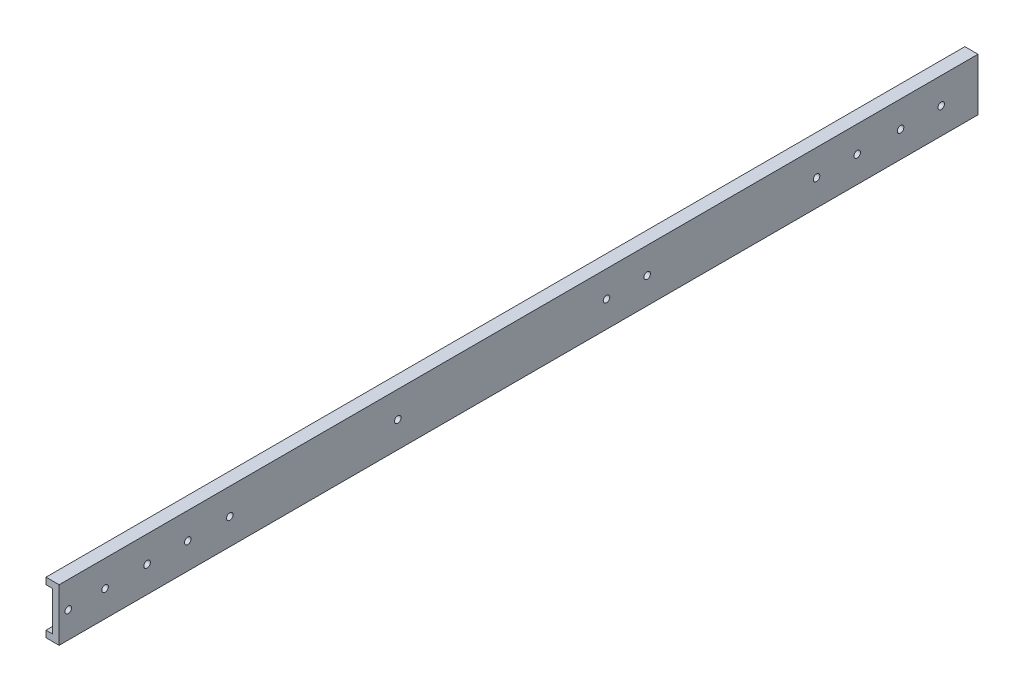
ISO-10303-21;
HEADER;
FILE_DESCRIPTION(('STEP AP214'),'2;1');
FILE_NAME('part.step','',(''),(''),'','','');
FILE_SCHEMA(('AUTOMOTIVE_DESIGN { 1 0 10303 214 1 1 1 1 }'));
ENDSEC;
DATA;
#1=APPLICATION_CONTEXT('core data for automotive mechanical design processes');
#2=APPLICATION_PROTOCOL_DEFINITION('international standard','automotive_design',2000,#1);
#3=PRODUCT_CONTEXT('',#1,'mechanical');
#4=PRODUCT('Part','Part','',(#3));
#5=PRODUCT_RELATED_PRODUCT_CATEGORY('part','',(#4));
#6=PRODUCT_DEFINITION_FORMATION('','',#4);
#7=PRODUCT_DEFINITION_CONTEXT('part definition',#1,'design');
#8=PRODUCT_DEFINITION('design','',#6,#7);
#9=PRODUCT_DEFINITION_SHAPE('','',#8);
#10=(LENGTH_UNIT() NAMED_UNIT(*) SI_UNIT(.MILLI.,.METRE.));
#11=(NAMED_UNIT(*) PLANE_ANGLE_UNIT() SI_UNIT($,.RADIAN.));
#12=(NAMED_UNIT(*) SI_UNIT($,.STERADIAN.) SOLID_ANGLE_UNIT());
#13=UNCERTAINTY_MEASURE_WITH_UNIT(LENGTH_MEASURE(1.E-05),#10,'distance_accuracy_value','');
#14=(GEOMETRIC_REPRESENTATION_CONTEXT(3) GLOBAL_UNCERTAINTY_ASSIGNED_CONTEXT((#13)) GLOBAL_UNIT_ASSIGNED_CONTEXT((#10,
#11,#12)) REPRESENTATION_CONTEXT('',''));
#15=CARTESIAN_POINT('',(0.,0.,0.));
#16=DIRECTION('',(0.,0.,1.));
#17=DIRECTION('',(1.,0.,0.));
#18=AXIS2_PLACEMENT_3D('',#15,#16,#17);
#19=CARTESIAN_POINT('',(0.,0.,700.));
#20=DIRECTION('',(1.,0.,0.));
#21=DIRECTION('',(0.,0.,-1.));
#22=AXIS2_PLACEMENT_3D('',#19,#20,#21);
#23=PLANE('',#22);
#24=DIRECTION('',(0.,-1.,0.));
#25=VECTOR('',#24,1.);
#26=CARTESIAN_POINT('',(0.,0.,0.));
#27=LINE('',#26,#25);
#28=CARTESIAN_POINT('',(0.,40.,0.));
#29=VERTEX_POINT('',#28);
#30=CARTESIAN_POINT('',(0.,35.,0.));
#31=VERTEX_POINT('',#30);
#32=EDGE_CURVE('E135',#29,#31,#27,.T.);
#33=ORIENTED_EDGE('',*,*,#32,.T.);
#34=DIRECTION('',(0.,0.,1.));
#35=VECTOR('',#34,1.);
#36=CARTESIAN_POINT('',(0.,35.,0.));
#37=LINE('',#36,#35);
#38=CARTESIAN_POINT('',(0.,35.,700.));
#39=VERTEX_POINT('',#38);
#40=EDGE_CURVE('E215',#31,#39,#37,.T.);
#41=ORIENTED_EDGE('',*,*,#40,.T.);
#42=DIRECTION('',(0.,-1.,0.));
#43=VECTOR('',#42,1.);
#44=CARTESIAN_POINT('',(0.,0.,700.));
#45=LINE('',#44,#43);
#46=CARTESIAN_POINT('',(0.,40.,700.));
#47=VERTEX_POINT('',#46);
#48=EDGE_CURVE('E230',#47,#39,#45,.T.);
#49=ORIENTED_EDGE('',*,*,#48,.F.);
#50=DIRECTION('',(0.,0.,-1.));
#51=VECTOR('',#50,1.);
#52=CARTESIAN_POINT('',(0.,40.,700.));
#53=LINE('',#52,#51);
#54=EDGE_CURVE('E149',#47,#29,#53,.T.);
#55=ORIENTED_EDGE('',*,*,#54,.T.);
#56=EDGE_LOOP('',(#33,#41,#49,#55));
#57=FACE_BOUND('',#56,.T.);
#58=ADVANCED_FACE('F40',(#57),#23,.F.);
#59=CARTESIAN_POINT('',(0.,5.,700.));
#60=VERTEX_POINT('',#59);
#61=CARTESIAN_POINT('',(0.,0.,700.));
#62=VERTEX_POINT('',#61);
#63=EDGE_CURVE('E94',#60,#62,#45,.T.);
#64=ORIENTED_EDGE('',*,*,#63,.F.);
#65=DIRECTION('',(0.,0.,1.));
#66=VECTOR('',#65,1.);
#67=CARTESIAN_POINT('',(0.,5.,0.));
#68=LINE('',#67,#66);
#69=CARTESIAN_POINT('',(0.,5.,0.));
#70=VERTEX_POINT('',#69);
#71=EDGE_CURVE('E120',#70,#60,#68,.T.);
#72=ORIENTED_EDGE('',*,*,#71,.F.);
#73=CARTESIAN_POINT('',(0.,0.,0.));
#74=VERTEX_POINT('',#73);
#75=EDGE_CURVE('E127',#70,#74,#27,.T.);
#76=ORIENTED_EDGE('',*,*,#75,.T.);
#77=DIRECTION('',(0.,0.,-1.));
#78=VECTOR('',#77,1.);
#79=CARTESIAN_POINT('',(0.,0.,700.));
#80=LINE('',#79,#78);
#81=EDGE_CURVE('E11',#62,#74,#80,.T.);
#82=ORIENTED_EDGE('',*,*,#81,.F.);
#83=EDGE_LOOP('',(#64,#72,#76,#82));
#84=FACE_BOUND('',#83,.T.);
#85=ADVANCED_FACE('F42',(#84),#23,.F.);
#86=CARTESIAN_POINT('',(0.,0.,700.));
#87=DIRECTION('',(0.,1.,0.));
#88=DIRECTION('',(0.,0.,1.));
#89=AXIS2_PLACEMENT_3D('',#86,#87,#88);
#90=PLANE('',#89);
#91=DIRECTION('',(1.,0.,0.));
#92=VECTOR('',#91,1.);
#93=CARTESIAN_POINT('',(0.,0.,0.));
#94=LINE('',#93,#92);
#95=CARTESIAN_POINT('',(10.,0.,0.));
#96=VERTEX_POINT('',#95);
#97=EDGE_CURVE('E134',#74,#96,#94,.T.);
#98=ORIENTED_EDGE('',*,*,#97,.T.);
#99=DIRECTION('',(0.,0.,-1.));
#100=VECTOR('',#99,1.);
#101=CARTESIAN_POINT('',(10.,0.,700.));
#102=LINE('',#101,#100);
#103=CARTESIAN_POINT('',(10.,0.,700.));
#104=VERTEX_POINT('',#103);
#105=EDGE_CURVE('E49',#104,#96,#102,.T.);
#106=ORIENTED_EDGE('',*,*,#105,.F.);
#107=DIRECTION('',(1.,0.,0.));
#108=VECTOR('',#107,1.);
#109=CARTESIAN_POINT('',(0.,0.,700.));
#110=LINE('',#109,#108);
#111=EDGE_CURVE('E232',#62,#104,#110,.T.);
#112=ORIENTED_EDGE('',*,*,#111,.F.);
#113=ORIENTED_EDGE('',*,*,#81,.T.);
#114=EDGE_LOOP('',(#98,#106,#112,#113));
#115=FACE_BOUND('',#114,.T.);
#116=ADVANCED_FACE('F211',(#115),#90,.F.);
#117=CARTESIAN_POINT('',(10.,0.,700.));
#118=DIRECTION('',(-1.,0.,0.));
#119=DIRECTION('',(0.,0.,1.));
#120=AXIS2_PLACEMENT_3D('',#117,#118,#119);
#121=PLANE('',#120);
#122=CARTESIAN_POINT('',(10.,20.,693.));
#123=DIRECTION('',(1.,0.,0.));
#124=DIRECTION('',(0.,0.,-1.));
#125=AXIS2_PLACEMENT_3D('',#122,#123,#124);
#126=CIRCLE('',#125,2.49999999999991);
#127=CARTESIAN_POINT('',(10.,20.,690.5));
#128=VERTEX_POINT('',#127);
#129=EDGE_CURVE('E159',#128,#128,#126,.T.);
#130=ORIENTED_EDGE('',*,*,#129,.F.);
#131=EDGE_LOOP('',(#130));
#132=FACE_BOUND('',#131,.T.);
#133=CARTESIAN_POINT('',(10.,20.,665.));
#134=DIRECTION('',(1.,0.,0.));
#135=DIRECTION('',(0.,0.,-1.));
#136=AXIS2_PLACEMENT_3D('',#133,#134,#135);
#137=CIRCLE('',#136,2.49999999999991);
#138=CARTESIAN_POINT('',(10.,20.,662.5));
#139=VERTEX_POINT('',#138);
#140=EDGE_CURVE('E440',#139,#139,#137,.T.);
#141=ORIENTED_EDGE('',*,*,#140,.F.);
#142=EDGE_LOOP('',(#141));
#143=FACE_BOUND('',#142,.T.);
#144=CARTESIAN_POINT('',(10.,20.,633.));
#145=DIRECTION('',(1.,0.,0.));
#146=DIRECTION('',(0.,0.,-1.));
#147=AXIS2_PLACEMENT_3D('',#144,#145,#146);
#148=CIRCLE('',#147,2.49999999999991);
#149=CARTESIAN_POINT('',(10.,20.,630.5));
#150=VERTEX_POINT('',#149);
#151=EDGE_CURVE('E409',#150,#150,#148,.T.);
#152=ORIENTED_EDGE('',*,*,#151,.F.);
#153=EDGE_LOOP('',(#152));
#154=FACE_BOUND('',#153,.T.);
#155=CARTESIAN_POINT('',(10.,20.,602.));
#156=DIRECTION('',(1.,0.,0.));
#157=DIRECTION('',(0.,0.,-1.));
#158=AXIS2_PLACEMENT_3D('',#155,#156,#157);
#159=CIRCLE('',#158,2.49999999999991);
#160=CARTESIAN_POINT('',(10.,20.,599.5));
#161=VERTEX_POINT('',#160);
#162=EDGE_CURVE('E441',#161,#161,#159,.T.);
#163=ORIENTED_EDGE('',*,*,#162,.F.);
#164=EDGE_LOOP('',(#163));
#165=FACE_BOUND('',#164,.T.);
#166=CARTESIAN_POINT('',(10.,20.,570.));
#167=DIRECTION('',(1.,0.,0.));
#168=DIRECTION('',(0.,0.,-1.));
#169=AXIS2_PLACEMENT_3D('',#166,#167,#168);
#170=CIRCLE('',#169,2.49999999999991);
#171=CARTESIAN_POINT('',(10.,20.,567.5));
#172=VERTEX_POINT('',#171);
#173=EDGE_CURVE('E446',#172,#172,#170,.T.);
#174=ORIENTED_EDGE('',*,*,#173,.F.);
#175=EDGE_LOOP('',(#174));
#176=FACE_BOUND('',#175,.T.);
#177=CARTESIAN_POINT('',(10.,20.,442.));
#178=DIRECTION('',(1.,0.,0.));
#179=DIRECTION('',(0.,0.,-1.));
#180=AXIS2_PLACEMENT_3D('',#177,#178,#179);
#181=CIRCLE('',#180,2.50000000000002);
#182=CARTESIAN_POINT('',(10.,20.,439.5));
#183=VERTEX_POINT('',#182);
#184=EDGE_CURVE('E452',#183,#183,#181,.T.);
#185=ORIENTED_EDGE('',*,*,#184,.F.);
#186=EDGE_LOOP('',(#185));
#187=FACE_BOUND('',#186,.T.);
#188=CARTESIAN_POINT('',(10.,20.,283.));
#189=DIRECTION('',(1.,0.,0.));
#190=DIRECTION('',(0.,0.,-1.));
#191=AXIS2_PLACEMENT_3D('',#188,#189,#190);
#192=CIRCLE('',#191,2.50000000000002);
#193=CARTESIAN_POINT('',(10.,20.,280.5));
#194=VERTEX_POINT('',#193);
#195=EDGE_CURVE('E455',#194,#194,#192,.T.);
#196=ORIENTED_EDGE('',*,*,#195,.F.);
#197=EDGE_LOOP('',(#196));
#198=FACE_BOUND('',#197,.T.);
#199=CARTESIAN_POINT('',(10.,20.,252.));
#200=DIRECTION('',(1.,0.,0.));
#201=DIRECTION('',(0.,0.,-1.));
#202=AXIS2_PLACEMENT_3D('',#199,#200,#201);
#203=CIRCLE('',#202,2.5);
#204=CARTESIAN_POINT('',(10.,20.,249.5));
#205=VERTEX_POINT('',#204);
#206=EDGE_CURVE('E458',#205,#205,#203,.T.);
#207=ORIENTED_EDGE('',*,*,#206,.F.);
#208=EDGE_LOOP('',(#207));
#209=FACE_BOUND('',#208,.T.);
#210=CARTESIAN_POINT('',(10.,20.,123.));
#211=DIRECTION('',(1.,0.,0.));
#212=DIRECTION('',(0.,0.,-1.));
#213=AXIS2_PLACEMENT_3D('',#210,#211,#212);
#214=CIRCLE('',#213,2.5);
#215=CARTESIAN_POINT('',(10.,20.,120.5));
#216=VERTEX_POINT('',#215);
#217=EDGE_CURVE('E461',#216,#216,#214,.T.);
#218=ORIENTED_EDGE('',*,*,#217,.F.);
#219=EDGE_LOOP('',(#218));
#220=FACE_BOUND('',#219,.T.);
#221=CARTESIAN_POINT('',(10.,20.,92.));
#222=DIRECTION('',(1.,0.,0.));
#223=DIRECTION('',(0.,0.,-1.));
#224=AXIS2_PLACEMENT_3D('',#221,#222,#223);
#225=CIRCLE('',#224,2.5);
#226=CARTESIAN_POINT('',(10.,20.,89.5));
#227=VERTEX_POINT('',#226);
#228=EDGE_CURVE('E464',#227,#227,#225,.T.);
#229=ORIENTED_EDGE('',*,*,#228,.F.);
#230=EDGE_LOOP('',(#229));
#231=FACE_BOUND('',#230,.T.);
#232=CARTESIAN_POINT('',(10.,20.,58.9999999999999));
#233=DIRECTION('',(1.,0.,0.));
#234=DIRECTION('',(0.,0.,-1.));
#235=AXIS2_PLACEMENT_3D('',#232,#233,#234);
#236=CIRCLE('',#235,2.5);
#237=CARTESIAN_POINT('',(10.,20.,56.4999999999999));
#238=VERTEX_POINT('',#237);
#239=EDGE_CURVE('E467',#238,#238,#236,.T.);
#240=ORIENTED_EDGE('',*,*,#239,.F.);
#241=EDGE_LOOP('',(#240));
#242=FACE_BOUND('',#241,.T.);
#243=CARTESIAN_POINT('',(10.,20.,27.9999999999999));
#244=DIRECTION('',(1.,0.,0.));
#245=DIRECTION('',(0.,0.,-1.));
#246=AXIS2_PLACEMENT_3D('',#243,#244,#245);
#247=CIRCLE('',#246,2.5);
#248=CARTESIAN_POINT('',(10.,20.,25.4999999999999));
#249=VERTEX_POINT('',#248);
#250=EDGE_CURVE('E470',#249,#249,#247,.T.);
#251=ORIENTED_EDGE('',*,*,#250,.F.);
#252=EDGE_LOOP('',(#251));
#253=FACE_BOUND('',#252,.T.);
#254=DIRECTION('',(0.,1.,0.));
#255=VECTOR('',#254,1.);
#256=CARTESIAN_POINT('',(10.,0.,0.));
#257=LINE('',#256,#255);
#258=CARTESIAN_POINT('',(10.,40.,0.));
#259=VERTEX_POINT('',#258);
#260=EDGE_CURVE('E146',#96,#259,#257,.T.);
#261=ORIENTED_EDGE('',*,*,#260,.T.);
#262=DIRECTION('',(0.,0.,-1.));
#263=VECTOR('',#262,1.);
#264=CARTESIAN_POINT('',(10.,40.,700.));
#265=LINE('',#264,#263);
#266=CARTESIAN_POINT('',(10.,40.,700.));
#267=VERTEX_POINT('',#266);
#268=EDGE_CURVE('E151',#267,#259,#265,.T.);
#269=ORIENTED_EDGE('',*,*,#268,.F.);
#270=DIRECTION('',(0.,1.,0.));
#271=VECTOR('',#270,1.);
#272=CARTESIAN_POINT('',(10.,0.,700.));
#273=LINE('',#272,#271);
#274=EDGE_CURVE('E233',#104,#267,#273,.T.);
#275=ORIENTED_EDGE('',*,*,#274,.F.);
#276=ORIENTED_EDGE('',*,*,#105,.T.);
#277=EDGE_LOOP('',(#261,#269,#275,#276));
#278=FACE_BOUND('',#277,.T.);
#279=ADVANCED_FACE('F239',(#132,#143,#154,#165,#176,#187,#198,#209,#220,#231,#242,#253,#278),
#121,.F.);
#280=CARTESIAN_POINT('',(0.,40.,700.));
#281=DIRECTION('',(0.,-1.,0.));
#282=DIRECTION('',(0.,0.,-1.));
#283=AXIS2_PLACEMENT_3D('',#280,#281,#282);
#284=PLANE('',#283);
#285=DIRECTION('',(-1.,0.,0.));
#286=VECTOR('',#285,1.);
#287=CARTESIAN_POINT('',(0.,40.,0.));
#288=LINE('',#287,#286);
#289=EDGE_CURVE('E87',#259,#29,#288,.T.);
#290=ORIENTED_EDGE('',*,*,#289,.T.);
#291=ORIENTED_EDGE('',*,*,#54,.F.);
#292=DIRECTION('',(-1.,0.,0.));
#293=VECTOR('',#292,1.);
#294=CARTESIAN_POINT('',(0.,40.,700.));
#295=LINE('',#294,#293);
#296=EDGE_CURVE('E66',#267,#47,#295,.T.);
#297=ORIENTED_EDGE('',*,*,#296,.F.);
#298=ORIENTED_EDGE('',*,*,#268,.T.);
#299=EDGE_LOOP('',(#290,#291,#297,#298));
#300=FACE_BOUND('',#299,.T.);
#301=ADVANCED_FACE('F240',(#300),#284,.F.);
#302=CARTESIAN_POINT('',(0.,0.,700.));
#303=DIRECTION('',(0.,0.,-1.));
#304=DIRECTION('',(-1.,0.,0.));
#305=AXIS2_PLACEMENT_3D('',#302,#303,#304);
#306=PLANE('',#305);
#307=ORIENTED_EDGE('',*,*,#48,.T.);
#308=DIRECTION('',(1.,0.,0.));
#309=VECTOR('',#308,1.);
#310=CARTESIAN_POINT('',(0.,35.,700.));
#311=LINE('',#310,#309);
#312=CARTESIAN_POINT('',(5.,35.,700.));
#313=VERTEX_POINT('',#312);
#314=EDGE_CURVE('E136',#39,#313,#311,.T.);
#315=ORIENTED_EDGE('',*,*,#314,.T.);
#316=DIRECTION('',(0.,-1.,0.));
#317=VECTOR('',#316,1.);
#318=CARTESIAN_POINT('',(5.,0.,700.));
#319=LINE('',#318,#317);
#320=CARTESIAN_POINT('',(5.,5.,700.));
#321=VERTEX_POINT('',#320);
#322=EDGE_CURVE('E140',#313,#321,#319,.T.);
#323=ORIENTED_EDGE('',*,*,#322,.T.);
#324=DIRECTION('',(-1.,0.,0.));
#325=VECTOR('',#324,1.);
#326=CARTESIAN_POINT('',(0.,5.,700.));
#327=LINE('',#326,#325);
#328=EDGE_CURVE('E223',#321,#60,#327,.T.);
#329=ORIENTED_EDGE('',*,*,#328,.T.);
#330=ORIENTED_EDGE('',*,*,#63,.T.);
#331=ORIENTED_EDGE('',*,*,#111,.T.);
#332=ORIENTED_EDGE('',*,*,#274,.T.);
#333=ORIENTED_EDGE('',*,*,#296,.T.);
#334=EDGE_LOOP('',(#307,#315,#323,#329,#330,#331,#332,#333));
#335=FACE_BOUND('',#334,.T.);
#336=ADVANCED_FACE('F236',(#335),#306,.F.);
#337=CARTESIAN_POINT('',(0.,0.,0.));
#338=DIRECTION('',(0.,0.,-1.));
#339=DIRECTION('',(-1.,0.,0.));
#340=AXIS2_PLACEMENT_3D('',#337,#338,#339);
#341=PLANE('',#340);
#342=DIRECTION('',(-1.,0.,0.));
#343=VECTOR('',#342,1.);
#344=CARTESIAN_POINT('',(0.,35.,0.));
#345=LINE('',#344,#343);
#346=CARTESIAN_POINT('',(5.,35.,0.));
#347=VERTEX_POINT('',#346);
#348=EDGE_CURVE('E129',#347,#31,#345,.T.);
#349=ORIENTED_EDGE('',*,*,#348,.T.);
#350=ORIENTED_EDGE('',*,*,#32,.F.);
#351=ORIENTED_EDGE('',*,*,#289,.F.);
#352=ORIENTED_EDGE('',*,*,#260,.F.);
#353=ORIENTED_EDGE('',*,*,#97,.F.);
#354=ORIENTED_EDGE('',*,*,#75,.F.);
#355=DIRECTION('',(1.,0.,0.));
#356=VECTOR('',#355,1.);
#357=CARTESIAN_POINT('',(0.,5.,0.));
#358=LINE('',#357,#356);
#359=CARTESIAN_POINT('',(5.,5.,0.));
#360=VERTEX_POINT('',#359);
#361=EDGE_CURVE('E117',#70,#360,#358,.T.);
#362=ORIENTED_EDGE('',*,*,#361,.T.);
#363=DIRECTION('',(0.,1.,0.));
#364=VECTOR('',#363,1.);
#365=CARTESIAN_POINT('',(5.,35.,0.));
#366=LINE('',#365,#364);
#367=EDGE_CURVE('E57',#360,#347,#366,.T.);
#368=ORIENTED_EDGE('',*,*,#367,.T.);
#369=EDGE_LOOP('',(#349,#350,#351,#352,#353,#354,#362,#368));
#370=FACE_BOUND('',#369,.T.);
#371=ADVANCED_FACE('F132',(#370),#341,.T.);
#372=CARTESIAN_POINT('',(0.,35.,0.));
#373=DIRECTION('',(0.,1.,0.));
#374=DIRECTION('',(0.,0.,1.));
#375=AXIS2_PLACEMENT_3D('',#372,#373,#374);
#376=PLANE('',#375);
#377=ORIENTED_EDGE('',*,*,#40,.F.);
#378=ORIENTED_EDGE('',*,*,#348,.F.);
#379=DIRECTION('',(0.,0.,1.));
#380=VECTOR('',#379,1.);
#381=CARTESIAN_POINT('',(5.,35.,0.));
#382=LINE('',#381,#380);
#383=EDGE_CURVE('E224',#347,#313,#382,.T.);
#384=ORIENTED_EDGE('',*,*,#383,.T.);
#385=ORIENTED_EDGE('',*,*,#314,.F.);
#386=EDGE_LOOP('',(#377,#378,#384,#385));
#387=FACE_BOUND('',#386,.T.);
#388=ADVANCED_FACE('F241',(#387),#376,.F.);
#389=CARTESIAN_POINT('',(5.,35.,0.));
#390=DIRECTION('',(1.,0.,0.));
#391=DIRECTION('',(0.,1.,0.));
#392=AXIS2_PLACEMENT_3D('',#389,#390,#391);
#393=PLANE('',#392);
#394=CARTESIAN_POINT('',(5.,20.,693.));
#395=DIRECTION('',(1.,0.,0.));
#396=DIRECTION('',(0.,1.,0.));
#397=AXIS2_PLACEMENT_3D('',#394,#395,#396);
#398=CIRCLE('',#397,2.49999999999991);
#399=CARTESIAN_POINT('',(5.,22.4999999999999,693.));
#400=VERTEX_POINT('',#399);
#401=EDGE_CURVE('E44',#400,#400,#398,.T.);
#402=ORIENTED_EDGE('',*,*,#401,.T.);
#403=EDGE_LOOP('',(#402));
#404=FACE_BOUND('',#403,.T.);
#405=CARTESIAN_POINT('',(5.,20.,665.));
#406=DIRECTION('',(1.,0.,0.));
#407=DIRECTION('',(0.,1.,0.));
#408=AXIS2_PLACEMENT_3D('',#405,#406,#407);
#409=CIRCLE('',#408,2.49999999999991);
#410=CARTESIAN_POINT('',(5.,22.4999999999999,665.));
#411=VERTEX_POINT('',#410);
#412=EDGE_CURVE('E185',#411,#411,#409,.T.);
#413=ORIENTED_EDGE('',*,*,#412,.T.);
#414=EDGE_LOOP('',(#413));
#415=FACE_BOUND('',#414,.T.);
#416=CARTESIAN_POINT('',(5.,20.,633.));
#417=DIRECTION('',(1.,0.,0.));
#418=DIRECTION('',(0.,1.,0.));
#419=AXIS2_PLACEMENT_3D('',#416,#417,#418);
#420=CIRCLE('',#419,2.49999999999991);
#421=CARTESIAN_POINT('',(5.,22.4999999999999,633.));
#422=VERTEX_POINT('',#421);
#423=EDGE_CURVE('E183',#422,#422,#420,.T.);
#424=ORIENTED_EDGE('',*,*,#423,.T.);
#425=EDGE_LOOP('',(#424));
#426=FACE_BOUND('',#425,.T.);
#427=CARTESIAN_POINT('',(5.,20.,602.));
#428=DIRECTION('',(1.,0.,0.));
#429=DIRECTION('',(0.,1.,0.));
#430=AXIS2_PLACEMENT_3D('',#427,#428,#429);
#431=CIRCLE('',#430,2.49999999999991);
#432=CARTESIAN_POINT('',(5.,22.4999999999999,602.));
#433=VERTEX_POINT('',#432);
#434=EDGE_CURVE('E180',#433,#433,#431,.T.);
#435=ORIENTED_EDGE('',*,*,#434,.T.);
#436=EDGE_LOOP('',(#435));
#437=FACE_BOUND('',#436,.T.);
#438=CARTESIAN_POINT('',(5.,20.,570.));
#439=DIRECTION('',(1.,0.,0.));
#440=DIRECTION('',(0.,1.,0.));
#441=AXIS2_PLACEMENT_3D('',#438,#439,#440);
#442=CIRCLE('',#441,2.49999999999991);
#443=CARTESIAN_POINT('',(5.,22.4999999999999,570.));
#444=VERTEX_POINT('',#443);
#445=EDGE_CURVE('E177',#444,#444,#442,.T.);
#446=ORIENTED_EDGE('',*,*,#445,.T.);
#447=EDGE_LOOP('',(#446));
#448=FACE_BOUND('',#447,.T.);
#449=CARTESIAN_POINT('',(5.,20.,442.));
#450=DIRECTION('',(1.,0.,0.));
#451=DIRECTION('',(0.,1.,0.));
#452=AXIS2_PLACEMENT_3D('',#449,#450,#451);
#453=CIRCLE('',#452,2.50000000000002);
#454=CARTESIAN_POINT('',(5.,22.5,442.));
#455=VERTEX_POINT('',#454);
#456=EDGE_CURVE('E174',#455,#455,#453,.T.);
#457=ORIENTED_EDGE('',*,*,#456,.T.);
#458=EDGE_LOOP('',(#457));
#459=FACE_BOUND('',#458,.T.);
#460=CARTESIAN_POINT('',(5.,20.,283.));
#461=DIRECTION('',(1.,0.,0.));
#462=DIRECTION('',(0.,1.,0.));
#463=AXIS2_PLACEMENT_3D('',#460,#461,#462);
#464=CIRCLE('',#463,2.50000000000002);
#465=CARTESIAN_POINT('',(5.,22.5,283.));
#466=VERTEX_POINT('',#465);
#467=EDGE_CURVE('E171',#466,#466,#464,.T.);
#468=ORIENTED_EDGE('',*,*,#467,.T.);
#469=EDGE_LOOP('',(#468));
#470=FACE_BOUND('',#469,.T.);
#471=CARTESIAN_POINT('',(5.,20.,252.));
#472=DIRECTION('',(1.,0.,0.));
#473=DIRECTION('',(0.,1.,0.));
#474=AXIS2_PLACEMENT_3D('',#471,#472,#473);
#475=CIRCLE('',#474,2.5);
#476=CARTESIAN_POINT('',(5.,22.5,252.));
#477=VERTEX_POINT('',#476);
#478=EDGE_CURVE('E168',#477,#477,#475,.T.);
#479=ORIENTED_EDGE('',*,*,#478,.T.);
#480=EDGE_LOOP('',(#479));
#481=FACE_BOUND('',#480,.T.);
#482=CARTESIAN_POINT('',(5.,20.,123.));
#483=DIRECTION('',(1.,0.,0.));
#484=DIRECTION('',(0.,1.,0.));
#485=AXIS2_PLACEMENT_3D('',#482,#483,#484);
#486=CIRCLE('',#485,2.5);
#487=CARTESIAN_POINT('',(5.,22.5,123.));
#488=VERTEX_POINT('',#487);
#489=EDGE_CURVE('E165',#488,#488,#486,.T.);
#490=ORIENTED_EDGE('',*,*,#489,.T.);
#491=EDGE_LOOP('',(#490));
#492=FACE_BOUND('',#491,.T.);
#493=CARTESIAN_POINT('',(5.,20.,92.));
#494=DIRECTION('',(1.,0.,0.));
#495=DIRECTION('',(0.,1.,0.));
#496=AXIS2_PLACEMENT_3D('',#493,#494,#495);
#497=CIRCLE('',#496,2.5);
#498=CARTESIAN_POINT('',(5.,22.5,92.));
#499=VERTEX_POINT('',#498);
#500=EDGE_CURVE('E162',#499,#499,#497,.T.);
#501=ORIENTED_EDGE('',*,*,#500,.T.);
#502=EDGE_LOOP('',(#501));
#503=FACE_BOUND('',#502,.T.);
#504=CARTESIAN_POINT('',(5.,20.,58.9999999999999));
#505=DIRECTION('',(1.,0.,0.));
#506=DIRECTION('',(0.,1.,0.));
#507=AXIS2_PLACEMENT_3D('',#504,#505,#506);
#508=CIRCLE('',#507,2.5);
#509=CARTESIAN_POINT('',(5.,22.5,58.9999999999999));
#510=VERTEX_POINT('',#509);
#511=EDGE_CURVE('E158',#510,#510,#508,.T.);
#512=ORIENTED_EDGE('',*,*,#511,.T.);
#513=EDGE_LOOP('',(#512));
#514=FACE_BOUND('',#513,.T.);
#515=CARTESIAN_POINT('',(5.,20.,27.9999999999999));
#516=DIRECTION('',(1.,0.,0.));
#517=DIRECTION('',(0.,1.,0.));
#518=AXIS2_PLACEMENT_3D('',#515,#516,#517);
#519=CIRCLE('',#518,2.5);
#520=CARTESIAN_POINT('',(5.,22.5,27.9999999999999));
#521=VERTEX_POINT('',#520);
#522=EDGE_CURVE('E155',#521,#521,#519,.T.);
#523=ORIENTED_EDGE('',*,*,#522,.T.);
#524=EDGE_LOOP('',(#523));
#525=FACE_BOUND('',#524,.T.);
#526=ORIENTED_EDGE('',*,*,#383,.F.);
#527=ORIENTED_EDGE('',*,*,#367,.F.);
#528=DIRECTION('',(0.,0.,1.));
#529=VECTOR('',#528,1.);
#530=CARTESIAN_POINT('',(5.,5.,0.));
#531=LINE('',#530,#529);
#532=EDGE_CURVE('E121',#360,#321,#531,.T.);
#533=ORIENTED_EDGE('',*,*,#532,.T.);
#534=ORIENTED_EDGE('',*,*,#322,.F.);
#535=EDGE_LOOP('',(#526,#527,#533,#534));
#536=FACE_BOUND('',#535,.T.);
#537=ADVANCED_FACE('F192',(#404,#415,#426,#437,#448,#459,#470,#481,#492,#503,#514,#525,#536),
#393,.F.);
#538=CARTESIAN_POINT('',(0.,5.,0.));
#539=DIRECTION('',(0.,-1.,0.));
#540=DIRECTION('',(0.,0.,-1.));
#541=AXIS2_PLACEMENT_3D('',#538,#539,#540);
#542=PLANE('',#541);
#543=ORIENTED_EDGE('',*,*,#532,.F.);
#544=ORIENTED_EDGE('',*,*,#361,.F.);
#545=ORIENTED_EDGE('',*,*,#71,.T.);
#546=ORIENTED_EDGE('',*,*,#328,.F.);
#547=EDGE_LOOP('',(#543,#544,#545,#546));
#548=FACE_BOUND('',#547,.T.);
#549=ADVANCED_FACE('F119',(#548),#542,.F.);
#550=CARTESIAN_POINT('',(0.,20.,27.9999999999999));
#551=DIRECTION('',(1.,0.,0.));
#552=DIRECTION('',(0.,0.,-1.));
#553=AXIS2_PLACEMENT_3D('',#550,#551,#552);
#554=CYLINDRICAL_SURFACE('',#553,2.5);
#555=ORIENTED_EDGE('',*,*,#250,.T.);
#556=EDGE_LOOP('',(#555));
#557=FACE_BOUND('',#556,.T.);
#558=ORIENTED_EDGE('',*,*,#522,.F.);
#559=EDGE_LOOP('',(#558));
#560=FACE_BOUND('',#559,.T.);
#561=ADVANCED_FACE('F248',(#557,#560),#554,.F.);
#562=CARTESIAN_POINT('',(0.,20.,58.9999999999999));
#563=DIRECTION('',(1.,0.,0.));
#564=DIRECTION('',(0.,0.,-1.));
#565=AXIS2_PLACEMENT_3D('',#562,#563,#564);
#566=CYLINDRICAL_SURFACE('',#565,2.5);
#567=ORIENTED_EDGE('',*,*,#239,.T.);
#568=EDGE_LOOP('',(#567));
#569=FACE_BOUND('',#568,.T.);
#570=ORIENTED_EDGE('',*,*,#511,.F.);
#571=EDGE_LOOP('',(#570));
#572=FACE_BOUND('',#571,.T.);
#573=ADVANCED_FACE('F304',(#569,#572),#566,.F.);
#574=CARTESIAN_POINT('',(0.,20.,92.));
#575=DIRECTION('',(1.,0.,0.));
#576=DIRECTION('',(0.,0.,-1.));
#577=AXIS2_PLACEMENT_3D('',#574,#575,#576);
#578=CYLINDRICAL_SURFACE('',#577,2.5);
#579=ORIENTED_EDGE('',*,*,#228,.T.);
#580=EDGE_LOOP('',(#579));
#581=FACE_BOUND('',#580,.T.);
#582=ORIENTED_EDGE('',*,*,#500,.F.);
#583=EDGE_LOOP('',(#582));
#584=FACE_BOUND('',#583,.T.);
#585=ADVANCED_FACE('F310',(#581,#584),#578,.F.);
#586=CARTESIAN_POINT('',(0.,20.,123.));
#587=DIRECTION('',(1.,0.,0.));
#588=DIRECTION('',(0.,0.,-1.));
#589=AXIS2_PLACEMENT_3D('',#586,#587,#588);
#590=CYLINDRICAL_SURFACE('',#589,2.5);
#591=ORIENTED_EDGE('',*,*,#217,.T.);
#592=EDGE_LOOP('',(#591));
#593=FACE_BOUND('',#592,.T.);
#594=ORIENTED_EDGE('',*,*,#489,.F.);
#595=EDGE_LOOP('',(#594));
#596=FACE_BOUND('',#595,.T.);
#597=ADVANCED_FACE('F318',(#593,#596),#590,.F.);
#598=CARTESIAN_POINT('',(0.,20.,252.));
#599=DIRECTION('',(1.,0.,0.));
#600=DIRECTION('',(0.,0.,-1.));
#601=AXIS2_PLACEMENT_3D('',#598,#599,#600);
#602=CYLINDRICAL_SURFACE('',#601,2.5);
#603=ORIENTED_EDGE('',*,*,#206,.T.);
#604=EDGE_LOOP('',(#603));
#605=FACE_BOUND('',#604,.T.);
#606=ORIENTED_EDGE('',*,*,#478,.F.);
#607=EDGE_LOOP('',(#606));
#608=FACE_BOUND('',#607,.T.);
#609=ADVANCED_FACE('F326',(#605,#608),#602,.F.);
#610=CARTESIAN_POINT('',(0.,20.,283.));
#611=DIRECTION('',(1.,0.,0.));
#612=DIRECTION('',(0.,0.,-1.));
#613=AXIS2_PLACEMENT_3D('',#610,#611,#612);
#614=CYLINDRICAL_SURFACE('',#613,2.50000000000002);
#615=ORIENTED_EDGE('',*,*,#195,.T.);
#616=EDGE_LOOP('',(#615));
#617=FACE_BOUND('',#616,.T.);
#618=ORIENTED_EDGE('',*,*,#467,.F.);
#619=EDGE_LOOP('',(#618));
#620=FACE_BOUND('',#619,.T.);
#621=ADVANCED_FACE('F334',(#617,#620),#614,.F.);
#622=CARTESIAN_POINT('',(0.,20.,442.));
#623=DIRECTION('',(1.,0.,0.));
#624=DIRECTION('',(0.,0.,-1.));
#625=AXIS2_PLACEMENT_3D('',#622,#623,#624);
#626=CYLINDRICAL_SURFACE('',#625,2.50000000000002);
#627=ORIENTED_EDGE('',*,*,#184,.T.);
#628=EDGE_LOOP('',(#627));
#629=FACE_BOUND('',#628,.T.);
#630=ORIENTED_EDGE('',*,*,#456,.F.);
#631=EDGE_LOOP('',(#630));
#632=FACE_BOUND('',#631,.T.);
#633=ADVANCED_FACE('F342',(#629,#632),#626,.F.);
#634=CARTESIAN_POINT('',(0.,20.,570.));
#635=DIRECTION('',(1.,0.,0.));
#636=DIRECTION('',(0.,0.,-1.));
#637=AXIS2_PLACEMENT_3D('',#634,#635,#636);
#638=CYLINDRICAL_SURFACE('',#637,2.49999999999991);
#639=ORIENTED_EDGE('',*,*,#173,.T.);
#640=EDGE_LOOP('',(#639));
#641=FACE_BOUND('',#640,.T.);
#642=ORIENTED_EDGE('',*,*,#445,.F.);
#643=EDGE_LOOP('',(#642));
#644=FACE_BOUND('',#643,.T.);
#645=ADVANCED_FACE('F350',(#641,#644),#638,.F.);
#646=CARTESIAN_POINT('',(0.,20.,602.));
#647=DIRECTION('',(1.,0.,0.));
#648=DIRECTION('',(0.,0.,-1.));
#649=AXIS2_PLACEMENT_3D('',#646,#647,#648);
#650=CYLINDRICAL_SURFACE('',#649,2.49999999999991);
#651=ORIENTED_EDGE('',*,*,#162,.T.);
#652=EDGE_LOOP('',(#651));
#653=FACE_BOUND('',#652,.T.);
#654=ORIENTED_EDGE('',*,*,#434,.F.);
#655=EDGE_LOOP('',(#654));
#656=FACE_BOUND('',#655,.T.);
#657=ADVANCED_FACE('F358',(#653,#656),#650,.F.);
#658=CARTESIAN_POINT('',(0.,20.,633.));
#659=DIRECTION('',(1.,0.,0.));
#660=DIRECTION('',(0.,0.,-1.));
#661=AXIS2_PLACEMENT_3D('',#658,#659,#660);
#662=CYLINDRICAL_SURFACE('',#661,2.49999999999991);
#663=ORIENTED_EDGE('',*,*,#151,.T.);
#664=EDGE_LOOP('',(#663));
#665=FACE_BOUND('',#664,.T.);
#666=ORIENTED_EDGE('',*,*,#423,.F.);
#667=EDGE_LOOP('',(#666));
#668=FACE_BOUND('',#667,.T.);
#669=ADVANCED_FACE('F202',(#665,#668),#662,.F.);
#670=CARTESIAN_POINT('',(0.,20.,665.));
#671=DIRECTION('',(1.,0.,0.));
#672=DIRECTION('',(0.,0.,-1.));
#673=AXIS2_PLACEMENT_3D('',#670,#671,#672);
#674=CYLINDRICAL_SURFACE('',#673,2.49999999999991);
#675=ORIENTED_EDGE('',*,*,#140,.T.);
#676=EDGE_LOOP('',(#675));
#677=FACE_BOUND('',#676,.T.);
#678=ORIENTED_EDGE('',*,*,#412,.F.);
#679=EDGE_LOOP('',(#678));
#680=FACE_BOUND('',#679,.T.);
#681=ADVANCED_FACE('F196',(#677,#680),#674,.F.);
#682=CARTESIAN_POINT('',(0.,20.,693.));
#683=DIRECTION('',(1.,0.,0.));
#684=DIRECTION('',(0.,0.,-1.));
#685=AXIS2_PLACEMENT_3D('',#682,#683,#684);
#686=CYLINDRICAL_SURFACE('',#685,2.49999999999991);
#687=ORIENTED_EDGE('',*,*,#129,.T.);
#688=EDGE_LOOP('',(#687));
#689=FACE_BOUND('',#688,.T.);
#690=ORIENTED_EDGE('',*,*,#401,.F.);
#691=EDGE_LOOP('',(#690));
#692=FACE_BOUND('',#691,.T.);
#693=ADVANCED_FACE('F194',(#689,#692),#686,.F.);
#694=CLOSED_SHELL('',(#58,#85,#116,#279,#301,#336,#371,#388,#537,#549,#561,#573,#585,#597,#609,
#621,#633,#645,#657,#669,#681,#693));
#695=MANIFOLD_SOLID_BREP('B2',#694);
#696=ADVANCED_BREP_SHAPE_REPRESENTATION('',(#18,#695),#14);
#697=SHAPE_DEFINITION_REPRESENTATION(#9,#696);
ENDSEC;
END-ISO-10303-21;
